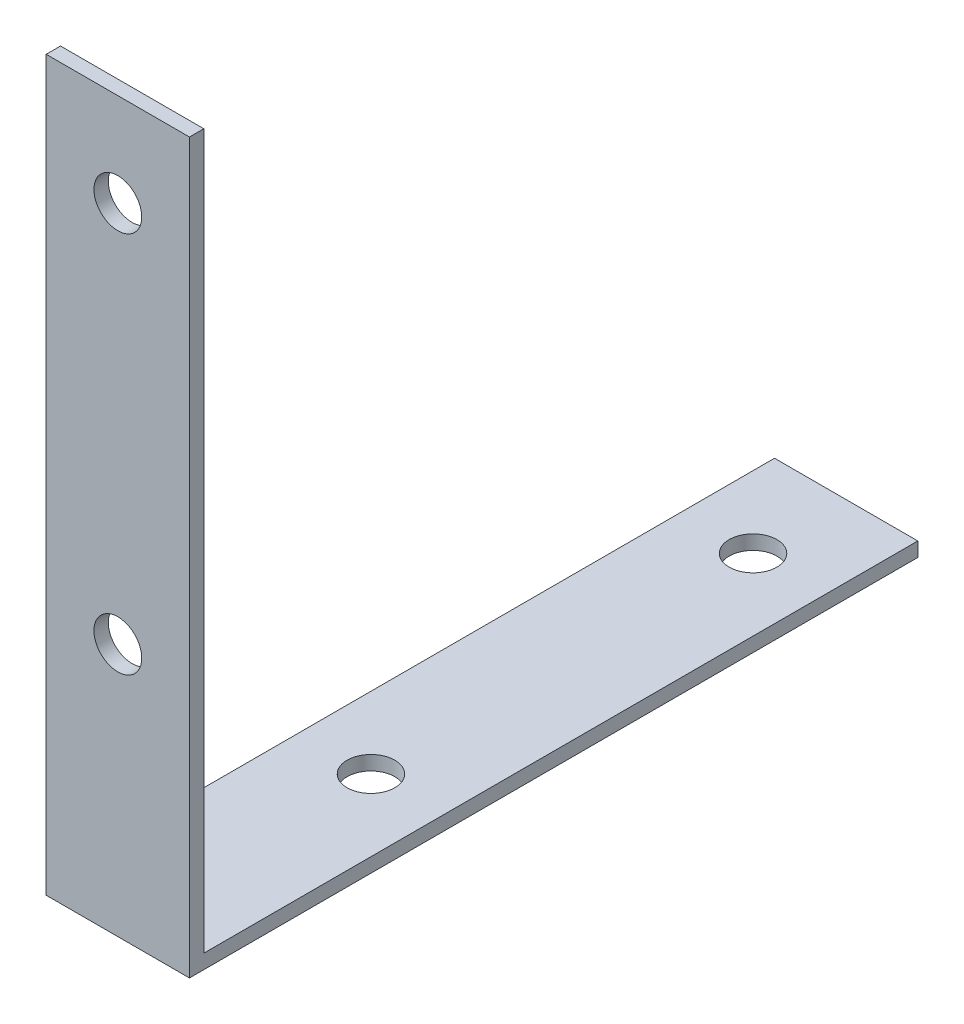
ISO-10303-21;
HEADER;
FILE_DESCRIPTION(('STEP AP214'),'2;1');
FILE_NAME('part.step','',(''),(''),'','','');
FILE_SCHEMA(('AUTOMOTIVE_DESIGN { 1 0 10303 214 1 1 1 1 }'));
ENDSEC;
DATA;
#1=APPLICATION_CONTEXT('core data for automotive mechanical design processes');
#2=APPLICATION_PROTOCOL_DEFINITION('international standard','automotive_design',2000,#1);
#3=PRODUCT_CONTEXT('',#1,'mechanical');
#4=PRODUCT('Part','Part','',(#3));
#5=PRODUCT_RELATED_PRODUCT_CATEGORY('part','',(#4));
#6=PRODUCT_DEFINITION_FORMATION('','',#4);
#7=PRODUCT_DEFINITION_CONTEXT('part definition',#1,'design');
#8=PRODUCT_DEFINITION('design','',#6,#7);
#9=PRODUCT_DEFINITION_SHAPE('','',#8);
#10=(LENGTH_UNIT() NAMED_UNIT(*) SI_UNIT(.MILLI.,.METRE.));
#11=(NAMED_UNIT(*) PLANE_ANGLE_UNIT() SI_UNIT($,.RADIAN.));
#12=(NAMED_UNIT(*) SI_UNIT($,.STERADIAN.) SOLID_ANGLE_UNIT());
#13=UNCERTAINTY_MEASURE_WITH_UNIT(LENGTH_MEASURE(1.E-05),#10,'distance_accuracy_value','');
#14=(GEOMETRIC_REPRESENTATION_CONTEXT(3) GLOBAL_UNCERTAINTY_ASSIGNED_CONTEXT((#13)) GLOBAL_UNIT_ASSIGNED_CONTEXT((#10,
#11,#12)) REPRESENTATION_CONTEXT('',''));
#15=CARTESIAN_POINT('',(0.,0.,0.));
#16=DIRECTION('',(0.,0.,1.));
#17=DIRECTION('',(1.,0.,0.));
#18=AXIS2_PLACEMENT_3D('',#15,#16,#17);
#19=CARTESIAN_POINT('',(12.,61.,0.));
#20=DIRECTION('',(0.,0.,-1.));
#21=DIRECTION('',(-1.,0.,0.));
#22=AXIS2_PLACEMENT_3D('',#19,#20,#21);
#23=PLANE('',#22);
#24=CARTESIAN_POINT('',(5.99999999999999,21.2,0.));
#25=DIRECTION('',(0.,0.,-1.));
#26=DIRECTION('',(-1.,0.,0.));
#27=AXIS2_PLACEMENT_3D('',#24,#25,#26);
#28=CIRCLE('',#27,2.);
#29=CARTESIAN_POINT('',(3.99999999999999,21.2,0.));
#30=VERTEX_POINT('',#29);
#31=EDGE_CURVE('E164',#30,#30,#28,.T.);
#32=ORIENTED_EDGE('',*,*,#31,.T.);
#33=EDGE_LOOP('',(#32));
#34=FACE_BOUND('',#33,.T.);
#35=CARTESIAN_POINT('',(6.,53.2,0.));
#36=DIRECTION('',(0.,0.,-1.));
#37=DIRECTION('',(-1.,0.,0.));
#38=AXIS2_PLACEMENT_3D('',#35,#36,#37);
#39=CIRCLE('',#38,2.);
#40=CARTESIAN_POINT('',(4.,53.2,0.));
#41=VERTEX_POINT('',#40);
#42=EDGE_CURVE('E167',#41,#41,#39,.T.);
#43=ORIENTED_EDGE('',*,*,#42,.T.);
#44=EDGE_LOOP('',(#43));
#45=FACE_BOUND('',#44,.T.);
#46=DIRECTION('',(0.,-1.,0.));
#47=VECTOR('',#46,1.);
#48=CARTESIAN_POINT('',(0.,61.,0.));
#49=LINE('',#48,#47);
#50=CARTESIAN_POINT('',(0.,61.,0.));
#51=VERTEX_POINT('',#50);
#52=CARTESIAN_POINT('',(0.,0.,0.));
#53=VERTEX_POINT('',#52);
#54=EDGE_CURVE('E119',#51,#53,#49,.T.);
#55=ORIENTED_EDGE('',*,*,#54,.T.);
#56=DIRECTION('',(-1.,0.,0.));
#57=VECTOR('',#56,1.);
#58=CARTESIAN_POINT('',(12.,0.,0.));
#59=LINE('',#58,#57);
#60=CARTESIAN_POINT('',(12.,0.,0.));
#61=VERTEX_POINT('',#60);
#62=EDGE_CURVE('E11',#61,#53,#59,.T.);
#63=ORIENTED_EDGE('',*,*,#62,.F.);
#64=DIRECTION('',(0.,-1.,0.));
#65=VECTOR('',#64,1.);
#66=CARTESIAN_POINT('',(12.,61.,0.));
#67=LINE('',#66,#65);
#68=CARTESIAN_POINT('',(12.,61.,0.));
#69=VERTEX_POINT('',#68);
#70=EDGE_CURVE('E130',#69,#61,#67,.T.);
#71=ORIENTED_EDGE('',*,*,#70,.F.);
#72=DIRECTION('',(-1.,0.,0.));
#73=VECTOR('',#72,1.);
#74=CARTESIAN_POINT('',(12.,61.,0.));
#75=LINE('',#74,#73);
#76=EDGE_CURVE('E115',#69,#51,#75,.T.);
#77=ORIENTED_EDGE('',*,*,#76,.T.);
#78=EDGE_LOOP('',(#55,#63,#71,#77));
#79=FACE_BOUND('',#78,.T.);
#80=ADVANCED_FACE('F35',(#34,#45,#79),#23,.F.);
#81=CARTESIAN_POINT('',(12.,0.,0.));
#82=DIRECTION('',(0.,1.,0.));
#83=DIRECTION('',(0.,0.,1.));
#84=AXIS2_PLACEMENT_3D('',#81,#82,#83);
#85=PLANE('',#84);
#86=CARTESIAN_POINT('',(6.00000000000001,0.,-21.2));
#87=DIRECTION('',(0.,1.,0.));
#88=DIRECTION('',(0.,0.,1.));
#89=AXIS2_PLACEMENT_3D('',#86,#87,#88);
#90=CIRCLE('',#89,2.);
#91=CARTESIAN_POINT('',(6.00000000000001,0.,-19.2));
#92=VERTEX_POINT('',#91);
#93=EDGE_CURVE('E123',#92,#92,#90,.T.);
#94=ORIENTED_EDGE('',*,*,#93,.T.);
#95=EDGE_LOOP('',(#94));
#96=FACE_BOUND('',#95,.T.);
#97=CARTESIAN_POINT('',(6.,0.,-53.2));
#98=DIRECTION('',(0.,1.,0.));
#99=DIRECTION('',(0.,0.,1.));
#100=AXIS2_PLACEMENT_3D('',#97,#98,#99);
#101=CIRCLE('',#100,2.);
#102=CARTESIAN_POINT('',(6.,0.,-51.2));
#103=VERTEX_POINT('',#102);
#104=EDGE_CURVE('E181',#103,#103,#101,.T.);
#105=ORIENTED_EDGE('',*,*,#104,.T.);
#106=EDGE_LOOP('',(#105));
#107=FACE_BOUND('',#106,.T.);
#108=DIRECTION('',(0.,0.,-1.));
#109=VECTOR('',#108,1.);
#110=CARTESIAN_POINT('',(0.,0.,0.));
#111=LINE('',#110,#109);
#112=CARTESIAN_POINT('',(0.,0.,-61.));
#113=VERTEX_POINT('',#112);
#114=EDGE_CURVE('E122',#53,#113,#111,.T.);
#115=ORIENTED_EDGE('',*,*,#114,.T.);
#116=DIRECTION('',(-1.,0.,0.));
#117=VECTOR('',#116,1.);
#118=CARTESIAN_POINT('',(12.,0.,-61.));
#119=LINE('',#118,#117);
#120=CARTESIAN_POINT('',(12.,0.,-61.));
#121=VERTEX_POINT('',#120);
#122=EDGE_CURVE('E43',#121,#113,#119,.T.);
#123=ORIENTED_EDGE('',*,*,#122,.F.);
#124=DIRECTION('',(0.,0.,-1.));
#125=VECTOR('',#124,1.);
#126=CARTESIAN_POINT('',(12.,0.,0.));
#127=LINE('',#126,#125);
#128=EDGE_CURVE('E88',#61,#121,#127,.T.);
#129=ORIENTED_EDGE('',*,*,#128,.F.);
#130=ORIENTED_EDGE('',*,*,#62,.T.);
#131=EDGE_LOOP('',(#115,#123,#129,#130));
#132=FACE_BOUND('',#131,.T.);
#133=ADVANCED_FACE('F155',(#96,#107,#132),#85,.F.);
#134=CARTESIAN_POINT('',(12.,0.,-61.));
#135=DIRECTION('',(0.,0.,1.));
#136=DIRECTION('',(1.,0.,0.));
#137=AXIS2_PLACEMENT_3D('',#134,#135,#136);
#138=PLANE('',#137);
#139=DIRECTION('',(0.,1.,0.));
#140=VECTOR('',#139,1.);
#141=CARTESIAN_POINT('',(0.,0.,-61.));
#142=LINE('',#141,#140);
#143=CARTESIAN_POINT('',(0.,1.2,-61.));
#144=VERTEX_POINT('',#143);
#145=EDGE_CURVE('E125',#113,#144,#142,.T.);
#146=ORIENTED_EDGE('',*,*,#145,.T.);
#147=DIRECTION('',(-1.,0.,0.));
#148=VECTOR('',#147,1.);
#149=CARTESIAN_POINT('',(12.,1.2,-61.));
#150=LINE('',#149,#148);
#151=CARTESIAN_POINT('',(12.,1.2,-61.));
#152=VERTEX_POINT('',#151);
#153=EDGE_CURVE('E110',#152,#144,#150,.T.);
#154=ORIENTED_EDGE('',*,*,#153,.F.);
#155=DIRECTION('',(0.,1.,0.));
#156=VECTOR('',#155,1.);
#157=CARTESIAN_POINT('',(12.,0.,-61.));
#158=LINE('',#157,#156);
#159=EDGE_CURVE('E101',#121,#152,#158,.T.);
#160=ORIENTED_EDGE('',*,*,#159,.F.);
#161=ORIENTED_EDGE('',*,*,#122,.T.);
#162=EDGE_LOOP('',(#146,#154,#160,#161));
#163=FACE_BOUND('',#162,.T.);
#164=ADVANCED_FACE('F136',(#163),#138,.F.);
#165=CARTESIAN_POINT('',(12.,1.2,-61.));
#166=DIRECTION('',(0.,-1.,0.));
#167=DIRECTION('',(0.,0.,-1.));
#168=AXIS2_PLACEMENT_3D('',#165,#166,#167);
#169=PLANE('',#168);
#170=CARTESIAN_POINT('',(6.00000000000001,1.19999999999999,-21.2));
#171=DIRECTION('',(0.,1.,0.));
#172=DIRECTION('',(0.,0.,1.));
#173=AXIS2_PLACEMENT_3D('',#170,#171,#172);
#174=CIRCLE('',#173,2.);
#175=CARTESIAN_POINT('',(6.00000000000001,1.19999999999999,-19.2));
#176=VERTEX_POINT('',#175);
#177=EDGE_CURVE('E178',#176,#176,#174,.T.);
#178=ORIENTED_EDGE('',*,*,#177,.F.);
#179=EDGE_LOOP('',(#178));
#180=FACE_BOUND('',#179,.T.);
#181=CARTESIAN_POINT('',(6.,1.2,-53.2));
#182=DIRECTION('',(0.,1.,0.));
#183=DIRECTION('',(0.,0.,1.));
#184=AXIS2_PLACEMENT_3D('',#181,#182,#183);
#185=CIRCLE('',#184,2.);
#186=CARTESIAN_POINT('',(6.,1.2,-51.2));
#187=VERTEX_POINT('',#186);
#188=EDGE_CURVE('E171',#187,#187,#185,.T.);
#189=ORIENTED_EDGE('',*,*,#188,.F.);
#190=EDGE_LOOP('',(#189));
#191=FACE_BOUND('',#190,.T.);
#192=DIRECTION('',(0.,0.,1.));
#193=VECTOR('',#192,1.);
#194=CARTESIAN_POINT('',(0.,1.2,-61.));
#195=LINE('',#194,#193);
#196=CARTESIAN_POINT('',(0.,1.19999999999999,-1.20000000000001));
#197=VERTEX_POINT('',#196);
#198=EDGE_CURVE('E109',#144,#197,#195,.T.);
#199=ORIENTED_EDGE('',*,*,#198,.T.);
#200=DIRECTION('',(-1.,0.,0.));
#201=VECTOR('',#200,1.);
#202=CARTESIAN_POINT('',(12.,1.19999999999999,-1.20000000000001));
#203=LINE('',#202,#201);
#204=CARTESIAN_POINT('',(12.,1.19999999999999,-1.20000000000001));
#205=VERTEX_POINT('',#204);
#206=EDGE_CURVE('E106',#205,#197,#203,.T.);
#207=ORIENTED_EDGE('',*,*,#206,.F.);
#208=DIRECTION('',(0.,0.,1.));
#209=VECTOR('',#208,1.);
#210=CARTESIAN_POINT('',(12.,1.2,-61.));
#211=LINE('',#210,#209);
#212=EDGE_CURVE('E95',#152,#205,#211,.T.);
#213=ORIENTED_EDGE('',*,*,#212,.F.);
#214=ORIENTED_EDGE('',*,*,#153,.T.);
#215=EDGE_LOOP('',(#199,#207,#213,#214));
#216=FACE_BOUND('',#215,.T.);
#217=ADVANCED_FACE('F107',(#180,#191,#216),#169,.F.);
#218=CARTESIAN_POINT('',(12.,1.19999999999999,-1.20000000000001));
#219=DIRECTION('',(0.,0.,1.));
#220=DIRECTION('',(0.,-1.,0.));
#221=AXIS2_PLACEMENT_3D('',#218,#219,#220);
#222=PLANE('',#221);
#223=CARTESIAN_POINT('',(5.99999999999999,21.2,-1.20000000000001));
#224=DIRECTION('',(0.,0.,-1.));
#225=DIRECTION('',(0.,1.,0.));
#226=AXIS2_PLACEMENT_3D('',#223,#224,#225);
#227=CIRCLE('',#226,2.);
#228=CARTESIAN_POINT('',(5.99999999999999,23.2,-1.20000000000001));
#229=VERTEX_POINT('',#228);
#230=EDGE_CURVE('E169',#229,#229,#227,.T.);
#231=ORIENTED_EDGE('',*,*,#230,.F.);
#232=EDGE_LOOP('',(#231));
#233=FACE_BOUND('',#232,.T.);
#234=CARTESIAN_POINT('',(6.,53.2,-1.20000000000001));
#235=DIRECTION('',(0.,0.,-1.));
#236=DIRECTION('',(0.,1.,0.));
#237=AXIS2_PLACEMENT_3D('',#234,#235,#236);
#238=CIRCLE('',#237,2.);
#239=CARTESIAN_POINT('',(6.,55.2,-1.20000000000001));
#240=VERTEX_POINT('',#239);
#241=EDGE_CURVE('E174',#240,#240,#238,.T.);
#242=ORIENTED_EDGE('',*,*,#241,.F.);
#243=EDGE_LOOP('',(#242));
#244=FACE_BOUND('',#243,.T.);
#245=DIRECTION('',(0.,1.,0.));
#246=VECTOR('',#245,1.);
#247=CARTESIAN_POINT('',(0.,1.19999999999999,-1.20000000000001));
#248=LINE('',#247,#246);
#249=CARTESIAN_POINT('',(0.,61.,-1.20000000000001));
#250=VERTEX_POINT('',#249);
#251=EDGE_CURVE('E74',#197,#250,#248,.T.);
#252=ORIENTED_EDGE('',*,*,#251,.T.);
#253=DIRECTION('',(-1.,0.,0.));
#254=VECTOR('',#253,1.);
#255=CARTESIAN_POINT('',(12.,61.,-1.20000000000001));
#256=LINE('',#255,#254);
#257=CARTESIAN_POINT('',(12.,61.,-1.20000000000001));
#258=VERTEX_POINT('',#257);
#259=EDGE_CURVE('E111',#258,#250,#256,.T.);
#260=ORIENTED_EDGE('',*,*,#259,.F.);
#261=DIRECTION('',(0.,1.,0.));
#262=VECTOR('',#261,1.);
#263=CARTESIAN_POINT('',(12.,1.19999999999999,-1.20000000000001));
#264=LINE('',#263,#262);
#265=EDGE_CURVE('E99',#205,#258,#264,.T.);
#266=ORIENTED_EDGE('',*,*,#265,.F.);
#267=ORIENTED_EDGE('',*,*,#206,.T.);
#268=EDGE_LOOP('',(#252,#260,#266,#267));
#269=FACE_BOUND('',#268,.T.);
#270=ADVANCED_FACE('F113',(#233,#244,#269),#222,.F.);
#271=CARTESIAN_POINT('',(12.,61.,-1.20000000000001));
#272=DIRECTION('',(0.,-1.,0.));
#273=DIRECTION('',(0.,0.,-1.));
#274=AXIS2_PLACEMENT_3D('',#271,#272,#273);
#275=PLANE('',#274);
#276=DIRECTION('',(0.,0.,1.));
#277=VECTOR('',#276,1.);
#278=CARTESIAN_POINT('',(0.,61.,-1.20000000000001));
#279=LINE('',#278,#277);
#280=EDGE_CURVE('E80',#250,#51,#279,.T.);
#281=ORIENTED_EDGE('',*,*,#280,.T.);
#282=ORIENTED_EDGE('',*,*,#76,.F.);
#283=DIRECTION('',(0.,0.,1.));
#284=VECTOR('',#283,1.);
#285=CARTESIAN_POINT('',(12.,61.,-1.20000000000001));
#286=LINE('',#285,#284);
#287=EDGE_CURVE('E51',#258,#69,#286,.T.);
#288=ORIENTED_EDGE('',*,*,#287,.F.);
#289=ORIENTED_EDGE('',*,*,#259,.T.);
#290=EDGE_LOOP('',(#281,#282,#288,#289));
#291=FACE_BOUND('',#290,.T.);
#292=ADVANCED_FACE('F143',(#291),#275,.F.);
#293=CARTESIAN_POINT('',(12.,0.,0.));
#294=DIRECTION('',(1.,0.,0.));
#295=DIRECTION('',(0.,0.,-1.));
#296=AXIS2_PLACEMENT_3D('',#293,#294,#295);
#297=PLANE('',#296);
#298=ORIENTED_EDGE('',*,*,#70,.T.);
#299=ORIENTED_EDGE('',*,*,#128,.T.);
#300=ORIENTED_EDGE('',*,*,#159,.T.);
#301=ORIENTED_EDGE('',*,*,#212,.T.);
#302=ORIENTED_EDGE('',*,*,#265,.T.);
#303=ORIENTED_EDGE('',*,*,#287,.T.);
#304=EDGE_LOOP('',(#298,#299,#300,#301,#302,#303));
#305=FACE_BOUND('',#304,.T.);
#306=ADVANCED_FACE('F97',(#305),#297,.T.);
#307=CARTESIAN_POINT('',(0.,0.,0.));
#308=DIRECTION('',(1.,0.,0.));
#309=DIRECTION('',(0.,0.,-1.));
#310=AXIS2_PLACEMENT_3D('',#307,#308,#309);
#311=PLANE('',#310);
#312=ORIENTED_EDGE('',*,*,#54,.F.);
#313=ORIENTED_EDGE('',*,*,#280,.F.);
#314=ORIENTED_EDGE('',*,*,#251,.F.);
#315=ORIENTED_EDGE('',*,*,#198,.F.);
#316=ORIENTED_EDGE('',*,*,#145,.F.);
#317=ORIENTED_EDGE('',*,*,#114,.F.);
#318=EDGE_LOOP('',(#312,#313,#314,#315,#316,#317));
#319=FACE_BOUND('',#318,.T.);
#320=ADVANCED_FACE('F139',(#319),#311,.F.);
#321=CARTESIAN_POINT('',(6.,-10.8,-53.2));
#322=DIRECTION('',(0.,1.,0.));
#323=DIRECTION('',(0.,0.,1.));
#324=AXIS2_PLACEMENT_3D('',#321,#322,#323);
#325=CYLINDRICAL_SURFACE('',#324,2.);
#326=ORIENTED_EDGE('',*,*,#188,.T.);
#327=EDGE_LOOP('',(#326));
#328=FACE_BOUND('',#327,.T.);
#329=ORIENTED_EDGE('',*,*,#104,.F.);
#330=EDGE_LOOP('',(#329));
#331=FACE_BOUND('',#330,.T.);
#332=ADVANCED_FACE('F195',(#328,#331),#325,.F.);
#333=CARTESIAN_POINT('',(6.00000000000001,-10.8,-21.2));
#334=DIRECTION('',(0.,1.,0.));
#335=DIRECTION('',(0.,0.,1.));
#336=AXIS2_PLACEMENT_3D('',#333,#334,#335);
#337=CYLINDRICAL_SURFACE('',#336,2.);
#338=ORIENTED_EDGE('',*,*,#177,.T.);
#339=EDGE_LOOP('',(#338));
#340=FACE_BOUND('',#339,.T.);
#341=ORIENTED_EDGE('',*,*,#93,.F.);
#342=EDGE_LOOP('',(#341));
#343=FACE_BOUND('',#342,.T.);
#344=ADVANCED_FACE('F192',(#340,#343),#337,.F.);
#345=CARTESIAN_POINT('',(6.,53.2,10.8));
#346=DIRECTION('',(0.,0.,-1.));
#347=DIRECTION('',(0.,1.,0.));
#348=AXIS2_PLACEMENT_3D('',#345,#346,#347);
#349=CYLINDRICAL_SURFACE('',#348,2.);
#350=ORIENTED_EDGE('',*,*,#241,.T.);
#351=EDGE_LOOP('',(#350));
#352=FACE_BOUND('',#351,.T.);
#353=ORIENTED_EDGE('',*,*,#42,.F.);
#354=EDGE_LOOP('',(#353));
#355=FACE_BOUND('',#354,.T.);
#356=ADVANCED_FACE('F194',(#352,#355),#349,.F.);
#357=CARTESIAN_POINT('',(5.99999999999999,21.2,10.8));
#358=DIRECTION('',(0.,0.,-1.));
#359=DIRECTION('',(0.,1.,0.));
#360=AXIS2_PLACEMENT_3D('',#357,#358,#359);
#361=CYLINDRICAL_SURFACE('',#360,2.);
#362=ORIENTED_EDGE('',*,*,#230,.T.);
#363=EDGE_LOOP('',(#362));
#364=FACE_BOUND('',#363,.T.);
#365=ORIENTED_EDGE('',*,*,#31,.F.);
#366=EDGE_LOOP('',(#365));
#367=FACE_BOUND('',#366,.T.);
#368=ADVANCED_FACE('F202',(#364,#367),#361,.F.);
#369=CLOSED_SHELL('',(#80,#133,#164,#217,#270,#292,#306,#320,#332,#344,#356,#368));
#370=MANIFOLD_SOLID_BREP('B2',#369);
#371=ADVANCED_BREP_SHAPE_REPRESENTATION('',(#18,#370),#14);
#372=SHAPE_DEFINITION_REPRESENTATION(#9,#371);
ENDSEC;
END-ISO-10303-21;
